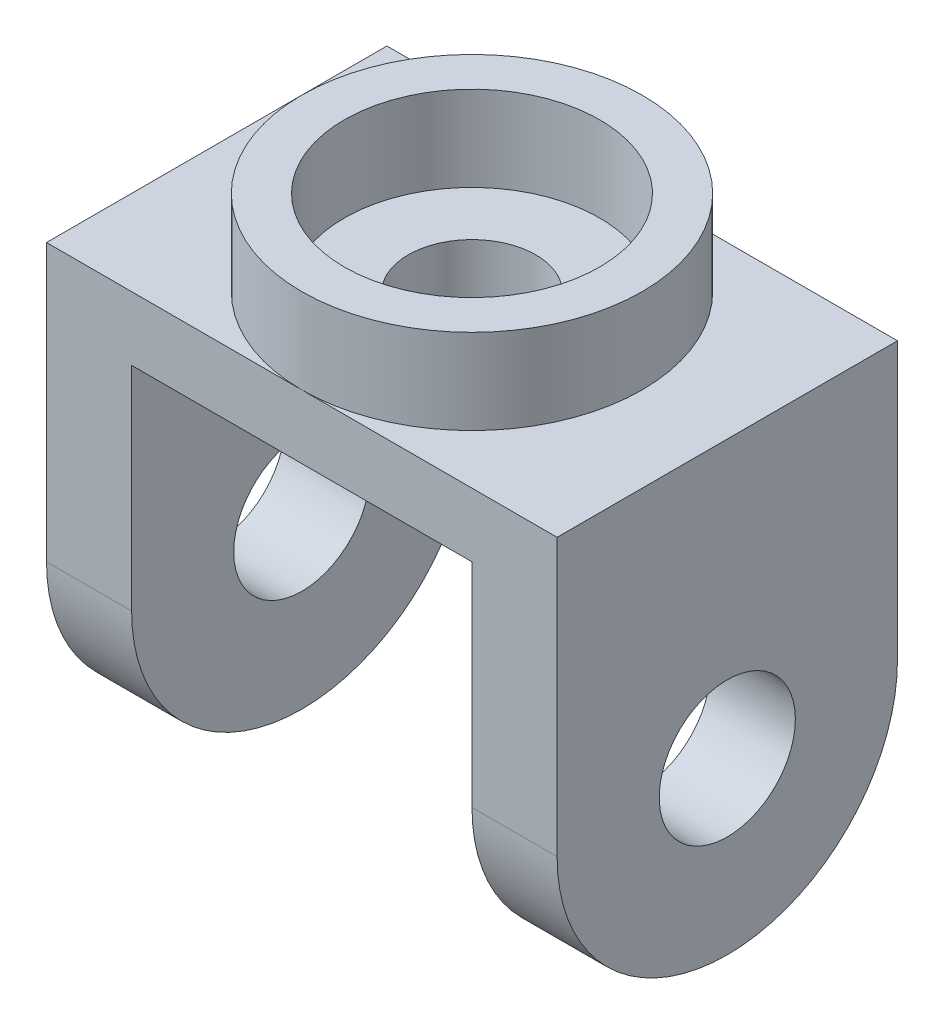
ISO-10303-21;
HEADER;
FILE_DESCRIPTION(('STEP AP214'),'2;1');
FILE_NAME('part.step','',(''),(''),'','','');
FILE_SCHEMA(('AUTOMOTIVE_DESIGN { 1 0 10303 214 1 1 1 1 }'));
ENDSEC;
DATA;
#1=APPLICATION_CONTEXT('core data for automotive mechanical design processes');
#2=APPLICATION_PROTOCOL_DEFINITION('international standard','automotive_design',2000,#1);
#3=PRODUCT_CONTEXT('',#1,'mechanical');
#4=PRODUCT('Part','Part','',(#3));
#5=PRODUCT_RELATED_PRODUCT_CATEGORY('part','',(#4));
#6=PRODUCT_DEFINITION_FORMATION('','',#4);
#7=PRODUCT_DEFINITION_CONTEXT('part definition',#1,'design');
#8=PRODUCT_DEFINITION('design','',#6,#7);
#9=PRODUCT_DEFINITION_SHAPE('','',#8);
#10=(LENGTH_UNIT() NAMED_UNIT(*) SI_UNIT(.MILLI.,.METRE.));
#11=(NAMED_UNIT(*) PLANE_ANGLE_UNIT() SI_UNIT($,.RADIAN.));
#12=(NAMED_UNIT(*) SI_UNIT($,.STERADIAN.) SOLID_ANGLE_UNIT());
#13=UNCERTAINTY_MEASURE_WITH_UNIT(LENGTH_MEASURE(1.E-05),#10,'distance_accuracy_value','');
#14=(GEOMETRIC_REPRESENTATION_CONTEXT(3) GLOBAL_UNCERTAINTY_ASSIGNED_CONTEXT((#13)) GLOBAL_UNIT_ASSIGNED_CONTEXT((#10,
#11,#12)) REPRESENTATION_CONTEXT('',''));
#15=CARTESIAN_POINT('',(0.,0.,0.));
#16=DIRECTION('',(0.,0.,1.));
#17=DIRECTION('',(1.,0.,0.));
#18=AXIS2_PLACEMENT_3D('',#15,#16,#17);
#19=CARTESIAN_POINT('',(0.,0.,0.));
#20=DIRECTION('',(0.,1.,0.));
#21=DIRECTION('',(0.,0.,1.));
#22=AXIS2_PLACEMENT_3D('',#19,#20,#21);
#23=PLANE('',#22);
#24=CARTESIAN_POINT('',(0.,0.,0.));
#25=DIRECTION('',(0.,1.,0.));
#26=DIRECTION('',(0.,0.,1.));
#27=AXIS2_PLACEMENT_3D('',#24,#25,#26);
#28=CIRCLE('',#27,15000.);
#29=CARTESIAN_POINT('',(0.,0.,15000.));
#30=VERTEX_POINT('',#29);
#31=EDGE_CURVE('E193',#30,#30,#28,.T.);
#32=ORIENTED_EDGE('',*,*,#31,.T.);
#33=EDGE_LOOP('',(#32));
#34=FACE_BOUND('',#33,.T.);
#35=DIRECTION('',(0.,0.,1.));
#36=VECTOR('',#35,1.);
#37=CARTESIAN_POINT('',(40000.,0.,40000.));
#38=LINE('',#37,#36);
#39=CARTESIAN_POINT('',(40000.,0.,-40000.));
#40=VERTEX_POINT('',#39);
#41=CARTESIAN_POINT('',(40000.,0.,40000.));
#42=VERTEX_POINT('',#41);
#43=EDGE_CURVE('E117',#40,#42,#38,.T.);
#44=ORIENTED_EDGE('',*,*,#43,.T.);
#45=DIRECTION('',(1.,0.,0.));
#46=VECTOR('',#45,1.);
#47=CARTESIAN_POINT('',(-60000.,0.,40000.));
#48=LINE('',#47,#46);
#49=CARTESIAN_POINT('',(-40000.,0.,40000.));
#50=VERTEX_POINT('',#49);
#51=EDGE_CURVE('E130',#50,#42,#48,.T.);
#52=ORIENTED_EDGE('',*,*,#51,.F.);
#53=DIRECTION('',(0.,0.,1.));
#54=VECTOR('',#53,1.);
#55=CARTESIAN_POINT('',(-40000.,0.,-40000.));
#56=LINE('',#55,#54);
#57=CARTESIAN_POINT('',(-40000.,0.,-40000.));
#58=VERTEX_POINT('',#57);
#59=EDGE_CURVE('E157',#58,#50,#56,.T.);
#60=ORIENTED_EDGE('',*,*,#59,.F.);
#61=DIRECTION('',(-1.,0.,0.));
#62=VECTOR('',#61,1.);
#63=CARTESIAN_POINT('',(-60000.,0.,-40000.));
#64=LINE('',#63,#62);
#65=EDGE_CURVE('E37',#40,#58,#64,.T.);
#66=ORIENTED_EDGE('',*,*,#65,.F.);
#67=EDGE_LOOP('',(#44,#52,#60,#66));
#68=FACE_BOUND('',#67,.T.);
#69=ADVANCED_FACE('F33',(#34,#68),#23,.F.);
#70=CARTESIAN_POINT('',(0.,15000.,0.));
#71=DIRECTION('',(0.,1.,0.));
#72=DIRECTION('',(0.,0.,1.));
#73=AXIS2_PLACEMENT_3D('',#70,#71,#72);
#74=PLANE('',#73);
#75=CARTESIAN_POINT('',(0.,15000.,0.));
#76=DIRECTION('',(0.,1.,0.));
#77=DIRECTION('',(0.,0.,1.));
#78=AXIS2_PLACEMENT_3D('',#75,#76,#77);
#79=CIRCLE('',#78,40000.);
#80=CARTESIAN_POINT('',(0.,15000.,40000.));
#81=VERTEX_POINT('',#80);
#82=CARTESIAN_POINT('',(0.,15000.,-40000.));
#83=VERTEX_POINT('',#82);
#84=EDGE_CURVE('E45',#81,#83,#79,.T.);
#85=ORIENTED_EDGE('',*,*,#84,.F.);
#86=DIRECTION('',(1.,0.,0.));
#87=VECTOR('',#86,1.);
#88=CARTESIAN_POINT('',(-60000.,15000.,40000.));
#89=LINE('',#88,#87);
#90=CARTESIAN_POINT('',(60000.,15000.,40000.));
#91=VERTEX_POINT('',#90);
#92=EDGE_CURVE('E217',#81,#91,#89,.T.);
#93=ORIENTED_EDGE('',*,*,#92,.T.);
#94=DIRECTION('',(0.,0.,-1.));
#95=VECTOR('',#94,1.);
#96=CARTESIAN_POINT('',(60000.,15000.,-40000.));
#97=LINE('',#96,#95);
#98=CARTESIAN_POINT('',(60000.,15000.,-40000.));
#99=VERTEX_POINT('',#98);
#100=EDGE_CURVE('E208',#91,#99,#97,.T.);
#101=ORIENTED_EDGE('',*,*,#100,.T.);
#102=DIRECTION('',(-1.,0.,0.));
#103=VECTOR('',#102,1.);
#104=CARTESIAN_POINT('',(-60000.,15000.,-40000.));
#105=LINE('',#104,#103);
#106=EDGE_CURVE('E212',#99,#83,#105,.T.);
#107=ORIENTED_EDGE('',*,*,#106,.T.);
#108=EDGE_LOOP('',(#85,#93,#101,#107));
#109=FACE_BOUND('',#108,.T.);
#110=ADVANCED_FACE('F235',(#109),#74,.T.);
#111=CARTESIAN_POINT('',(60000.,15000.,-40000.));
#112=DIRECTION('',(-1.,0.,0.));
#113=DIRECTION('',(0.,0.,1.));
#114=AXIS2_PLACEMENT_3D('',#111,#112,#113);
#115=PLANE('',#114);
#116=CARTESIAN_POINT('',(60000.,-50000.,-3.5527136788005E-12));
#117=DIRECTION('',(1.,0.,0.));
#118=DIRECTION('',(0.,0.,-1.));
#119=AXIS2_PLACEMENT_3D('',#116,#117,#118);
#120=CIRCLE('',#119,16000.);
#121=CARTESIAN_POINT('',(60000.,-50000.,-16000.));
#122=VERTEX_POINT('',#121);
#123=EDGE_CURVE('E135',#122,#122,#120,.T.);
#124=ORIENTED_EDGE('',*,*,#123,.F.);
#125=EDGE_LOOP('',(#124));
#126=FACE_BOUND('',#125,.T.);
#127=DIRECTION('',(0.,-1.,0.));
#128=VECTOR('',#127,1.);
#129=CARTESIAN_POINT('',(60000.,15000.,40000.));
#130=LINE('',#129,#128);
#131=CARTESIAN_POINT('',(60000.,-50000.,40000.));
#132=VERTEX_POINT('',#131);
#133=EDGE_CURVE('E219',#91,#132,#130,.T.);
#134=ORIENTED_EDGE('',*,*,#133,.T.);
#135=CARTESIAN_POINT('',(60000.,-50000.,-3.5527136788005E-12));
#136=DIRECTION('',(1.,0.,0.));
#137=DIRECTION('',(0.,0.,-1.));
#138=AXIS2_PLACEMENT_3D('',#135,#136,#137);
#139=CIRCLE('',#138,40000.);
#140=CARTESIAN_POINT('',(60000.,-50000.,-40000.));
#141=VERTEX_POINT('',#140);
#142=EDGE_CURVE('E112',#132,#141,#139,.T.);
#143=ORIENTED_EDGE('',*,*,#142,.T.);
#144=DIRECTION('',(0.,-1.,0.));
#145=VECTOR('',#144,1.);
#146=CARTESIAN_POINT('',(60000.,15000.,-40000.));
#147=LINE('',#146,#145);
#148=EDGE_CURVE('E43',#99,#141,#147,.T.);
#149=ORIENTED_EDGE('',*,*,#148,.F.);
#150=ORIENTED_EDGE('',*,*,#100,.F.);
#151=EDGE_LOOP('',(#134,#143,#149,#150));
#152=FACE_BOUND('',#151,.T.);
#153=ADVANCED_FACE('F35',(#126,#152),#115,.F.);
#154=CARTESIAN_POINT('',(-60000.,15000.,-40000.));
#155=DIRECTION('',(0.,0.,1.));
#156=DIRECTION('',(1.,0.,0.));
#157=AXIS2_PLACEMENT_3D('',#154,#155,#156);
#158=PLANE('',#157);
#159=ORIENTED_EDGE('',*,*,#148,.T.);
#160=DIRECTION('',(1.,0.,0.));
#161=VECTOR('',#160,1.);
#162=CARTESIAN_POINT('',(40000.,-50000.,-40000.));
#163=LINE('',#162,#161);
#164=CARTESIAN_POINT('',(40000.,-50000.,-40000.));
#165=VERTEX_POINT('',#164);
#166=EDGE_CURVE('E116',#165,#141,#163,.T.);
#167=ORIENTED_EDGE('',*,*,#166,.F.);
#168=DIRECTION('',(0.,1.,0.));
#169=VECTOR('',#168,1.);
#170=CARTESIAN_POINT('',(40000.,0.,-40000.));
#171=LINE('',#170,#169);
#172=EDGE_CURVE('E125',#165,#40,#171,.T.);
#173=ORIENTED_EDGE('',*,*,#172,.T.);
#174=ORIENTED_EDGE('',*,*,#65,.T.);
#175=DIRECTION('',(0.,-1.,0.));
#176=VECTOR('',#175,1.);
#177=CARTESIAN_POINT('',(-40000.,0.,-40000.));
#178=LINE('',#177,#176);
#179=CARTESIAN_POINT('',(-40000.,-50000.,-40000.));
#180=VERTEX_POINT('',#179);
#181=EDGE_CURVE('E161',#58,#180,#178,.T.);
#182=ORIENTED_EDGE('',*,*,#181,.T.);
#183=DIRECTION('',(-1.,0.,0.));
#184=VECTOR('',#183,1.);
#185=CARTESIAN_POINT('',(-40000.,-50000.,-40000.));
#186=LINE('',#185,#184);
#187=CARTESIAN_POINT('',(-60000.,-50000.,-40000.));
#188=VERTEX_POINT('',#187);
#189=EDGE_CURVE('E154',#180,#188,#186,.T.);
#190=ORIENTED_EDGE('',*,*,#189,.T.);
#191=DIRECTION('',(0.,-1.,0.));
#192=VECTOR('',#191,1.);
#193=CARTESIAN_POINT('',(-60000.,15000.,-40000.));
#194=LINE('',#193,#192);
#195=CARTESIAN_POINT('',(-60000.,15000.,-40000.));
#196=VERTEX_POINT('',#195);
#197=EDGE_CURVE('E226',#196,#188,#194,.T.);
#198=ORIENTED_EDGE('',*,*,#197,.F.);
#199=EDGE_CURVE('E211',#83,#196,#105,.T.);
#200=ORIENTED_EDGE('',*,*,#199,.F.);
#201=ORIENTED_EDGE('',*,*,#106,.F.);
#202=EDGE_LOOP('',(#159,#167,#173,#174,#182,#190,#198,#200,#201));
#203=FACE_BOUND('',#202,.T.);
#204=ADVANCED_FACE('F228',(#203),#158,.F.);
#205=CARTESIAN_POINT('',(-60000.,15000.,-40000.));
#206=DIRECTION('',(1.,0.,0.));
#207=DIRECTION('',(0.,0.,-1.));
#208=AXIS2_PLACEMENT_3D('',#205,#206,#207);
#209=PLANE('',#208);
#210=CARTESIAN_POINT('',(-60000.,-50000.,5.32907051820075E-12));
#211=DIRECTION('',(-1.,0.,0.));
#212=DIRECTION('',(0.,0.,1.));
#213=AXIS2_PLACEMENT_3D('',#210,#211,#212);
#214=CIRCLE('',#213,16000.);
#215=CARTESIAN_POINT('',(-60000.,-50000.,16000.));
#216=VERTEX_POINT('',#215);
#217=EDGE_CURVE('E140',#216,#216,#214,.T.);
#218=ORIENTED_EDGE('',*,*,#217,.F.);
#219=EDGE_LOOP('',(#218));
#220=FACE_BOUND('',#219,.T.);
#221=ORIENTED_EDGE('',*,*,#197,.T.);
#222=CARTESIAN_POINT('',(-60000.,-50000.,5.32907051820075E-12));
#223=DIRECTION('',(-1.,0.,0.));
#224=DIRECTION('',(0.,0.,-1.));
#225=AXIS2_PLACEMENT_3D('',#222,#223,#224);
#226=CIRCLE('',#225,40000.);
#227=CARTESIAN_POINT('',(-60000.,-50000.,40000.));
#228=VERTEX_POINT('',#227);
#229=EDGE_CURVE('E149',#188,#228,#226,.T.);
#230=ORIENTED_EDGE('',*,*,#229,.T.);
#231=DIRECTION('',(0.,-1.,0.));
#232=VECTOR('',#231,1.);
#233=CARTESIAN_POINT('',(-60000.,15000.,40000.));
#234=LINE('',#233,#232);
#235=CARTESIAN_POINT('',(-60000.,15000.,40000.));
#236=VERTEX_POINT('',#235);
#237=EDGE_CURVE('E224',#236,#228,#234,.T.);
#238=ORIENTED_EDGE('',*,*,#237,.F.);
#239=DIRECTION('',(0.,0.,1.));
#240=VECTOR('',#239,1.);
#241=CARTESIAN_POINT('',(-60000.,15000.,-40000.));
#242=LINE('',#241,#240);
#243=EDGE_CURVE('E215',#196,#236,#242,.T.);
#244=ORIENTED_EDGE('',*,*,#243,.F.);
#245=EDGE_LOOP('',(#221,#230,#238,#244));
#246=FACE_BOUND('',#245,.T.);
#247=ADVANCED_FACE('F265',(#220,#246),#209,.F.);
#248=CARTESIAN_POINT('',(-60000.,15000.,40000.));
#249=DIRECTION('',(0.,0.,-1.));
#250=DIRECTION('',(-1.,0.,0.));
#251=AXIS2_PLACEMENT_3D('',#248,#249,#250);
#252=PLANE('',#251);
#253=ORIENTED_EDGE('',*,*,#237,.T.);
#254=DIRECTION('',(-1.,0.,0.));
#255=VECTOR('',#254,1.);
#256=CARTESIAN_POINT('',(-40000.,-50000.,40000.));
#257=LINE('',#256,#255);
#258=CARTESIAN_POINT('',(-40000.,-50000.,40000.));
#259=VERTEX_POINT('',#258);
#260=EDGE_CURVE('E169',#259,#228,#257,.T.);
#261=ORIENTED_EDGE('',*,*,#260,.F.);
#262=DIRECTION('',(0.,-1.,0.));
#263=VECTOR('',#262,1.);
#264=CARTESIAN_POINT('',(-40000.,0.,40000.));
#265=LINE('',#264,#263);
#266=EDGE_CURVE('E148',#50,#259,#265,.T.);
#267=ORIENTED_EDGE('',*,*,#266,.F.);
#268=ORIENTED_EDGE('',*,*,#51,.T.);
#269=DIRECTION('',(0.,-1.,0.));
#270=VECTOR('',#269,1.);
#271=CARTESIAN_POINT('',(40000.,0.,40000.));
#272=LINE('',#271,#270);
#273=CARTESIAN_POINT('',(40000.,-50000.,40000.));
#274=VERTEX_POINT('',#273);
#275=EDGE_CURVE('E123',#42,#274,#272,.T.);
#276=ORIENTED_EDGE('',*,*,#275,.T.);
#277=DIRECTION('',(1.,0.,0.));
#278=VECTOR('',#277,1.);
#279=CARTESIAN_POINT('',(40000.,-50000.,40000.));
#280=LINE('',#279,#278);
#281=EDGE_CURVE('E106',#274,#132,#280,.T.);
#282=ORIENTED_EDGE('',*,*,#281,.T.);
#283=ORIENTED_EDGE('',*,*,#133,.F.);
#284=ORIENTED_EDGE('',*,*,#92,.F.);
#285=EDGE_CURVE('E218',#236,#81,#89,.T.);
#286=ORIENTED_EDGE('',*,*,#285,.F.);
#287=EDGE_LOOP('',(#253,#261,#267,#268,#276,#282,#283,#284,#286));
#288=FACE_BOUND('',#287,.T.);
#289=ADVANCED_FACE('F128',(#288),#252,.F.);
#290=EDGE_CURVE('E11',#83,#81,#79,.T.);
#291=ORIENTED_EDGE('',*,*,#290,.F.);
#292=ORIENTED_EDGE('',*,*,#199,.T.);
#293=ORIENTED_EDGE('',*,*,#243,.T.);
#294=ORIENTED_EDGE('',*,*,#285,.T.);
#295=EDGE_LOOP('',(#291,#292,#293,#294));
#296=FACE_BOUND('',#295,.T.);
#297=ADVANCED_FACE('F250',(#296),#74,.T.);
#298=CARTESIAN_POINT('',(0.,35000.,0.));
#299=DIRECTION('',(0.,1.,0.));
#300=DIRECTION('',(0.,0.,1.));
#301=AXIS2_PLACEMENT_3D('',#298,#299,#300);
#302=PLANE('',#301);
#303=CARTESIAN_POINT('',(0.,35000.,0.));
#304=DIRECTION('',(0.,1.,0.));
#305=DIRECTION('',(0.,0.,1.));
#306=AXIS2_PLACEMENT_3D('',#303,#304,#305);
#307=CIRCLE('',#306,40000.);
#308=CARTESIAN_POINT('',(0.,35000.,40000.));
#309=VERTEX_POINT('',#308);
#310=EDGE_CURVE('E204',#309,#309,#307,.T.);
#311=ORIENTED_EDGE('',*,*,#310,.T.);
#312=EDGE_LOOP('',(#311));
#313=FACE_BOUND('',#312,.T.);
#314=CARTESIAN_POINT('',(0.,35000.,0.));
#315=DIRECTION('',(0.,1.,0.));
#316=DIRECTION('',(0.,0.,1.));
#317=AXIS2_PLACEMENT_3D('',#314,#315,#316);
#318=CIRCLE('',#317,30000.);
#319=CARTESIAN_POINT('',(0.,35000.,30000.));
#320=VERTEX_POINT('',#319);
#321=EDGE_CURVE('E199',#320,#320,#318,.T.);
#322=ORIENTED_EDGE('',*,*,#321,.F.);
#323=EDGE_LOOP('',(#322));
#324=FACE_BOUND('',#323,.T.);
#325=ADVANCED_FACE('F240',(#313,#324),#302,.T.);
#326=CARTESIAN_POINT('',(0.,35000.,0.));
#327=DIRECTION('',(0.,-1.,0.));
#328=DIRECTION('',(0.,0.,-1.));
#329=AXIS2_PLACEMENT_3D('',#326,#327,#328);
#330=CYLINDRICAL_SURFACE('',#329,40000.);
#331=ORIENTED_EDGE('',*,*,#310,.F.);
#332=EDGE_LOOP('',(#331));
#333=FACE_BOUND('',#332,.T.);
#334=ORIENTED_EDGE('',*,*,#84,.T.);
#335=ORIENTED_EDGE('',*,*,#290,.T.);
#336=EDGE_LOOP('',(#334,#335));
#337=FACE_BOUND('',#336,.T.);
#338=ADVANCED_FACE('F237',(#333,#337),#330,.T.);
#339=CARTESIAN_POINT('',(0.,35000.,0.));
#340=DIRECTION('',(0.,-1.,0.));
#341=DIRECTION('',(0.,0.,-1.));
#342=AXIS2_PLACEMENT_3D('',#339,#340,#341);
#343=CYLINDRICAL_SURFACE('',#342,30000.);
#344=ORIENTED_EDGE('',*,*,#321,.T.);
#345=EDGE_LOOP('',(#344));
#346=FACE_BOUND('',#345,.T.);
#347=CARTESIAN_POINT('',(0.,15000.,0.));
#348=DIRECTION('',(0.,1.,0.));
#349=DIRECTION('',(0.,0.,1.));
#350=AXIS2_PLACEMENT_3D('',#347,#348,#349);
#351=CIRCLE('',#350,30000.);
#352=CARTESIAN_POINT('',(0.,15000.,30000.));
#353=VERTEX_POINT('',#352);
#354=EDGE_CURVE('E198',#353,#353,#351,.T.);
#355=ORIENTED_EDGE('',*,*,#354,.F.);
#356=EDGE_LOOP('',(#355));
#357=FACE_BOUND('',#356,.T.);
#358=ADVANCED_FACE('F239',(#346,#357),#343,.F.);
#359=CARTESIAN_POINT('',(0.,15000.,0.));
#360=DIRECTION('',(0.,1.,0.));
#361=DIRECTION('',(0.,0.,1.));
#362=AXIS2_PLACEMENT_3D('',#359,#360,#361);
#363=CIRCLE('',#362,15000.);
#364=CARTESIAN_POINT('',(0.,15000.,15000.));
#365=VERTEX_POINT('',#364);
#366=EDGE_CURVE('E191',#365,#365,#363,.T.);
#367=ORIENTED_EDGE('',*,*,#366,.F.);
#368=EDGE_LOOP('',(#367));
#369=FACE_BOUND('',#368,.T.);
#370=ORIENTED_EDGE('',*,*,#354,.T.);
#371=EDGE_LOOP('',(#370));
#372=FACE_BOUND('',#371,.T.);
#373=ADVANCED_FACE('F247',(#369,#372),#74,.T.);
#374=CARTESIAN_POINT('',(0.,-5000.,0.));
#375=DIRECTION('',(0.,1.,0.));
#376=DIRECTION('',(0.,0.,1.));
#377=AXIS2_PLACEMENT_3D('',#374,#375,#376);
#378=CYLINDRICAL_SURFACE('',#377,15000.);
#379=ORIENTED_EDGE('',*,*,#366,.T.);
#380=EDGE_LOOP('',(#379));
#381=FACE_BOUND('',#380,.T.);
#382=ORIENTED_EDGE('',*,*,#31,.F.);
#383=EDGE_LOOP('',(#382));
#384=FACE_BOUND('',#383,.T.);
#385=ADVANCED_FACE('F181',(#381,#384),#378,.F.);
#386=CARTESIAN_POINT('',(-40000.,0.,-1.77635683940025E-12));
#387=DIRECTION('',(1.,0.,0.));
#388=DIRECTION('',(0.,0.,-1.));
#389=AXIS2_PLACEMENT_3D('',#386,#387,#388);
#390=PLANE('',#389);
#391=CARTESIAN_POINT('',(-40000.,-50000.,3.5527136788005E-12));
#392=DIRECTION('',(1.,0.,0.));
#393=DIRECTION('',(0.,0.,-1.));
#394=AXIS2_PLACEMENT_3D('',#391,#392,#393);
#395=CIRCLE('',#394,16000.);
#396=CARTESIAN_POINT('',(-40000.,-50000.,-16000.));
#397=VERTEX_POINT('',#396);
#398=EDGE_CURVE('E144',#397,#397,#395,.T.);
#399=ORIENTED_EDGE('',*,*,#398,.F.);
#400=EDGE_LOOP('',(#399));
#401=FACE_BOUND('',#400,.T.);
#402=ORIENTED_EDGE('',*,*,#266,.T.);
#403=CARTESIAN_POINT('',(-40000.,-50000.,3.5527136788005E-12));
#404=DIRECTION('',(-1.,0.,0.));
#405=DIRECTION('',(0.,0.,-1.));
#406=AXIS2_PLACEMENT_3D('',#403,#404,#405);
#407=CIRCLE('',#406,40000.);
#408=EDGE_CURVE('E145',#180,#259,#407,.T.);
#409=ORIENTED_EDGE('',*,*,#408,.F.);
#410=ORIENTED_EDGE('',*,*,#181,.F.);
#411=ORIENTED_EDGE('',*,*,#59,.T.);
#412=EDGE_LOOP('',(#402,#409,#410,#411));
#413=FACE_BOUND('',#412,.T.);
#414=ADVANCED_FACE('F177',(#401,#413),#390,.T.);
#415=CARTESIAN_POINT('',(-40000.,-50000.,3.5527136788005E-12));
#416=DIRECTION('',(-1.,0.,0.));
#417=DIRECTION('',(0.,0.,1.));
#418=AXIS2_PLACEMENT_3D('',#415,#416,#417);
#419=CYLINDRICAL_SURFACE('',#418,40000.);
#420=ORIENTED_EDGE('',*,*,#229,.F.);
#421=ORIENTED_EDGE('',*,*,#189,.F.);
#422=ORIENTED_EDGE('',*,*,#408,.T.);
#423=ORIENTED_EDGE('',*,*,#260,.T.);
#424=EDGE_LOOP('',(#420,#421,#422,#423));
#425=FACE_BOUND('',#424,.T.);
#426=ADVANCED_FACE('F180',(#425),#419,.T.);
#427=CARTESIAN_POINT('',(-39500.0395695121,-50000.,3.50830827229417E-12));
#428=DIRECTION('',(-1.,0.,0.));
#429=DIRECTION('',(0.,0.,1.));
#430=AXIS2_PLACEMENT_3D('',#427,#428,#429);
#431=CYLINDRICAL_SURFACE('',#430,16000.);
#432=ORIENTED_EDGE('',*,*,#398,.T.);
#433=EDGE_LOOP('',(#432));
#434=FACE_BOUND('',#433,.T.);
#435=ORIENTED_EDGE('',*,*,#217,.T.);
#436=EDGE_LOOP('',(#435));
#437=FACE_BOUND('',#436,.T.);
#438=ADVANCED_FACE('F174',(#434,#437),#431,.F.);
#439=CARTESIAN_POINT('',(40000.,-50000.,0.));
#440=DIRECTION('',(1.,0.,0.));
#441=DIRECTION('',(0.,0.,-1.));
#442=AXIS2_PLACEMENT_3D('',#439,#440,#441);
#443=CYLINDRICAL_SURFACE('',#442,40000.);
#444=ORIENTED_EDGE('',*,*,#142,.F.);
#445=ORIENTED_EDGE('',*,*,#281,.F.);
#446=CARTESIAN_POINT('',(40000.,-50000.,0.));
#447=DIRECTION('',(1.,0.,0.));
#448=DIRECTION('',(0.,0.,-1.));
#449=AXIS2_PLACEMENT_3D('',#446,#447,#448);
#450=CIRCLE('',#449,40000.);
#451=EDGE_CURVE('E110',#274,#165,#450,.T.);
#452=ORIENTED_EDGE('',*,*,#451,.T.);
#453=ORIENTED_EDGE('',*,*,#166,.T.);
#454=EDGE_LOOP('',(#444,#445,#452,#453));
#455=FACE_BOUND('',#454,.T.);
#456=ADVANCED_FACE('F108',(#455),#443,.T.);
#457=CARTESIAN_POINT('',(40000.,-50000.,0.));
#458=DIRECTION('',(1.,0.,0.));
#459=DIRECTION('',(0.,0.,-1.));
#460=AXIS2_PLACEMENT_3D('',#457,#458,#459);
#461=PLANE('',#460);
#462=CARTESIAN_POINT('',(40000.,-50000.,0.));
#463=DIRECTION('',(1.,0.,0.));
#464=DIRECTION('',(0.,0.,-1.));
#465=AXIS2_PLACEMENT_3D('',#462,#463,#464);
#466=CIRCLE('',#465,16000.);
#467=CARTESIAN_POINT('',(40000.,-50000.,-16000.));
#468=VERTEX_POINT('',#467);
#469=EDGE_CURVE('E132',#468,#468,#466,.T.);
#470=ORIENTED_EDGE('',*,*,#469,.T.);
#471=EDGE_LOOP('',(#470));
#472=FACE_BOUND('',#471,.T.);
#473=ORIENTED_EDGE('',*,*,#275,.F.);
#474=ORIENTED_EDGE('',*,*,#43,.F.);
#475=ORIENTED_EDGE('',*,*,#172,.F.);
#476=ORIENTED_EDGE('',*,*,#451,.F.);
#477=EDGE_LOOP('',(#473,#474,#475,#476));
#478=FACE_BOUND('',#477,.T.);
#479=ADVANCED_FACE('F121',(#472,#478),#461,.F.);
#480=CARTESIAN_POINT('',(40000.,-50000.,0.));
#481=DIRECTION('',(1.,0.,0.));
#482=DIRECTION('',(0.,0.,-1.));
#483=AXIS2_PLACEMENT_3D('',#480,#481,#482);
#484=CYLINDRICAL_SURFACE('',#483,16000.);
#485=ORIENTED_EDGE('',*,*,#469,.F.);
#486=EDGE_LOOP('',(#485));
#487=FACE_BOUND('',#486,.T.);
#488=ORIENTED_EDGE('',*,*,#123,.T.);
#489=EDGE_LOOP('',(#488));
#490=FACE_BOUND('',#489,.T.);
#491=ADVANCED_FACE('F282',(#487,#490),#484,.F.);
#492=CLOSED_SHELL('',(#69,#110,#153,#204,#247,#289,#297,#325,#338,#358,#373,#385,#414,#426,#438,
#456,#479,#491));
#493=MANIFOLD_SOLID_BREP('B2',#492);
#494=ADVANCED_BREP_SHAPE_REPRESENTATION('',(#18,#493),#14);
#495=SHAPE_DEFINITION_REPRESENTATION(#9,#494);
ENDSEC;
END-ISO-10303-21;
